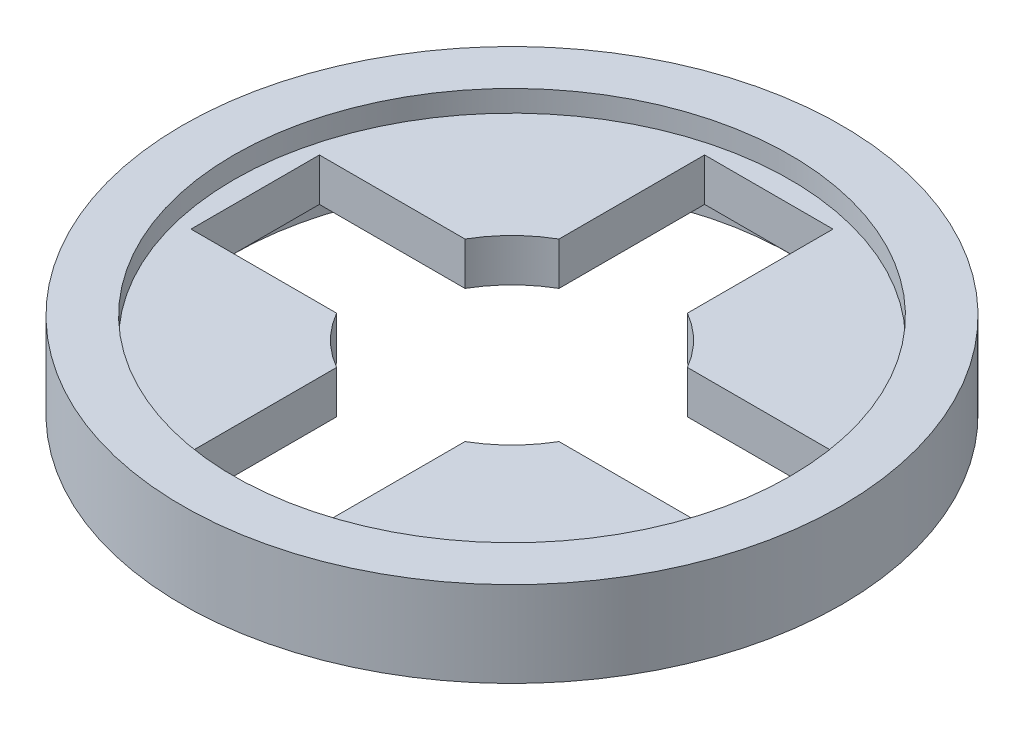
ISO-10303-21;
HEADER;
FILE_DESCRIPTION(('STEP AP214'),'2;1');
FILE_NAME('part.step','',(''),(''),'','','');
FILE_SCHEMA(('AUTOMOTIVE_DESIGN { 1 0 10303 214 1 1 1 1 }'));
ENDSEC;
DATA;
#1=APPLICATION_CONTEXT('core data for automotive mechanical design processes');
#2=APPLICATION_PROTOCOL_DEFINITION('international standard','automotive_design',2000,#1);
#3=PRODUCT_CONTEXT('',#1,'mechanical');
#4=PRODUCT('Part','Part','',(#3));
#5=PRODUCT_RELATED_PRODUCT_CATEGORY('part','',(#4));
#6=PRODUCT_DEFINITION_FORMATION('','',#4);
#7=PRODUCT_DEFINITION_CONTEXT('part definition',#1,'design');
#8=PRODUCT_DEFINITION('design','',#6,#7);
#9=PRODUCT_DEFINITION_SHAPE('','',#8);
#10=(LENGTH_UNIT() NAMED_UNIT(*) SI_UNIT(.MILLI.,.METRE.));
#11=(NAMED_UNIT(*) PLANE_ANGLE_UNIT() SI_UNIT($,.RADIAN.));
#12=(NAMED_UNIT(*) SI_UNIT($,.STERADIAN.) SOLID_ANGLE_UNIT());
#13=UNCERTAINTY_MEASURE_WITH_UNIT(LENGTH_MEASURE(1.E-05),#10,'distance_accuracy_value','');
#14=(GEOMETRIC_REPRESENTATION_CONTEXT(3) GLOBAL_UNCERTAINTY_ASSIGNED_CONTEXT((#13)) GLOBAL_UNIT_ASSIGNED_CONTEXT((#10,
#11,#12)) REPRESENTATION_CONTEXT('',''));
#15=CARTESIAN_POINT('',(0.,0.,0.));
#16=DIRECTION('',(0.,0.,1.));
#17=DIRECTION('',(1.,0.,0.));
#18=AXIS2_PLACEMENT_3D('',#15,#16,#17);
#19=CARTESIAN_POINT('',(0.,-0.5,0.));
#20=DIRECTION('',(0.,-1.,0.));
#21=DIRECTION('',(1.,0.,0.));
#22=AXIS2_PLACEMENT_3D('',#19,#20,#21);
#23=CYLINDRICAL_SURFACE('',#22,1.5);
#24=CARTESIAN_POINT('',(0.,0.249999999999999,0.));
#25=DIRECTION('',(0.,1.,0.));
#26=DIRECTION('',(-1.,0.,0.));
#27=AXIS2_PLACEMENT_3D('',#24,#25,#26);
#28=CIRCLE('',#27,1.5);
#29=CARTESIAN_POINT('',(-0.75,0.249999999999999,-1.29903810567666));
#30=VERTEX_POINT('',#29);
#31=CARTESIAN_POINT('',(-1.29903810567666,0.249999999999998,-0.75));
#32=VERTEX_POINT('',#31);
#33=EDGE_CURVE('E259',#30,#32,#28,.T.);
#34=ORIENTED_EDGE('',*,*,#33,.T.);
#35=DIRECTION('',(0.,-1.,0.));
#36=VECTOR('',#35,1.);
#37=CARTESIAN_POINT('',(-1.29903810567666,-0.500000000000001,-0.75));
#38=LINE('',#37,#36);
#39=CARTESIAN_POINT('',(-1.29903810567666,-0.250000000000001,-0.75));
#40=VERTEX_POINT('',#39);
#41=EDGE_CURVE('E170',#32,#40,#38,.T.);
#42=ORIENTED_EDGE('',*,*,#41,.T.);
#43=CARTESIAN_POINT('',(0.,-0.250000000000001,0.));
#44=DIRECTION('',(0.,-1.,0.));
#45=DIRECTION('',(1.,0.,0.));
#46=AXIS2_PLACEMENT_3D('',#43,#44,#45);
#47=CIRCLE('',#46,1.5);
#48=CARTESIAN_POINT('',(-0.75,-0.250000000000001,-1.29903810567666));
#49=VERTEX_POINT('',#48);
#50=EDGE_CURVE('E258',#40,#49,#47,.T.);
#51=ORIENTED_EDGE('',*,*,#50,.T.);
#52=DIRECTION('',(0.,-1.,0.));
#53=VECTOR('',#52,1.);
#54=CARTESIAN_POINT('',(-0.75,-0.500000000000001,-1.29903810567666));
#55=LINE('',#54,#53);
#56=EDGE_CURVE('E213',#49,#30,#55,.F.);
#57=ORIENTED_EDGE('',*,*,#56,.T.);
#58=EDGE_LOOP('',(#34,#42,#51,#57));
#59=FACE_BOUND('',#58,.T.);
#60=ADVANCED_FACE('F37',(#59),#23,.F.);
#61=CARTESIAN_POINT('',(0.,-0.250000000000001,0.));
#62=DIRECTION('',(0.,-1.,0.));
#63=DIRECTION('',(1.,0.,0.));
#64=AXIS2_PLACEMENT_3D('',#61,#62,#63);
#65=PLANE('',#64);
#66=CARTESIAN_POINT('',(0.,-0.250000000000001,0.));
#67=DIRECTION('',(0.,-1.,0.));
#68=DIRECTION('',(1.,0.,0.));
#69=AXIS2_PLACEMENT_3D('',#66,#67,#68);
#70=CIRCLE('',#69,3.25);
#71=CARTESIAN_POINT('',(3.25,-0.25,0.));
#72=VERTEX_POINT('',#71);
#73=EDGE_CURVE('E239',#72,#72,#70,.T.);
#74=ORIENTED_EDGE('',*,*,#73,.T.);
#75=EDGE_LOOP('',(#74));
#76=FACE_BOUND('',#75,.T.);
#77=ORIENTED_EDGE('',*,*,#50,.F.);
#78=DIRECTION('',(-1.,0.,0.));
#79=VECTOR('',#78,1.);
#80=CARTESIAN_POINT('',(0.,-0.250000000000001,-0.75));
#81=LINE('',#80,#79);
#82=CARTESIAN_POINT('',(-3.,-0.250000000000004,-0.75));
#83=VERTEX_POINT('',#82);
#84=EDGE_CURVE('E169',#40,#83,#81,.T.);
#85=ORIENTED_EDGE('',*,*,#84,.T.);
#86=DIRECTION('',(0.,0.,1.));
#87=VECTOR('',#86,1.);
#88=CARTESIAN_POINT('',(-3.,-0.250000000000003,0.));
#89=LINE('',#88,#87);
#90=CARTESIAN_POINT('',(-3.,-0.250000000000002,0.75));
#91=VERTEX_POINT('',#90);
#92=EDGE_CURVE('E156',#83,#91,#89,.T.);
#93=ORIENTED_EDGE('',*,*,#92,.T.);
#94=DIRECTION('',(-1.,0.,0.));
#95=VECTOR('',#94,1.);
#96=CARTESIAN_POINT('',(0.,-0.250000000000001,0.75));
#97=LINE('',#96,#95);
#98=CARTESIAN_POINT('',(-1.29903810567666,-0.250000000000001,0.75));
#99=VERTEX_POINT('',#98);
#100=EDGE_CURVE('E148',#99,#91,#97,.T.);
#101=ORIENTED_EDGE('',*,*,#100,.F.);
#102=CARTESIAN_POINT('',(-0.75,-0.250000000000001,1.29903810567666));
#103=VERTEX_POINT('',#102);
#104=EDGE_CURVE('E251',#103,#99,#47,.T.);
#105=ORIENTED_EDGE('',*,*,#104,.F.);
#106=DIRECTION('',(0.,0.,1.));
#107=VECTOR('',#106,1.);
#108=CARTESIAN_POINT('',(-0.75,-0.250000000000002,0.));
#109=LINE('',#108,#107);
#110=CARTESIAN_POINT('',(-0.750000000000001,-0.250000000000002,3.));
#111=VERTEX_POINT('',#110);
#112=EDGE_CURVE('E229',#103,#111,#109,.T.);
#113=ORIENTED_EDGE('',*,*,#112,.T.);
#114=DIRECTION('',(-1.,0.,0.));
#115=VECTOR('',#114,1.);
#116=CARTESIAN_POINT('',(0.,-0.250000000000001,3.));
#117=LINE('',#116,#115);
#118=CARTESIAN_POINT('',(0.749999999999999,-0.250000000000002,3.));
#119=VERTEX_POINT('',#118);
#120=EDGE_CURVE('E224',#119,#111,#117,.T.);
#121=ORIENTED_EDGE('',*,*,#120,.F.);
#122=DIRECTION('',(0.,0.,1.));
#123=VECTOR('',#122,1.);
#124=CARTESIAN_POINT('',(0.75,-0.250000000000001,0.));
#125=LINE('',#124,#123);
#126=CARTESIAN_POINT('',(0.75,-0.250000000000001,1.29903810567666));
#127=VERTEX_POINT('',#126);
#128=EDGE_CURVE('E222',#127,#119,#125,.T.);
#129=ORIENTED_EDGE('',*,*,#128,.F.);
#130=CARTESIAN_POINT('',(1.29903810567666,-0.250000000000001,0.75));
#131=VERTEX_POINT('',#130);
#132=EDGE_CURVE('E242',#131,#127,#47,.T.);
#133=ORIENTED_EDGE('',*,*,#132,.F.);
#134=DIRECTION('',(-1.,0.,0.));
#135=VECTOR('',#134,1.);
#136=CARTESIAN_POINT('',(0.,-0.250000000000001,0.75));
#137=LINE('',#136,#135);
#138=CARTESIAN_POINT('',(3.,-0.25,0.75));
#139=VERTEX_POINT('',#138);
#140=EDGE_CURVE('E191',#139,#131,#137,.T.);
#141=ORIENTED_EDGE('',*,*,#140,.F.);
#142=DIRECTION('',(0.,0.,1.));
#143=VECTOR('',#142,1.);
#144=CARTESIAN_POINT('',(3.,-0.25,0.));
#145=LINE('',#144,#143);
#146=CARTESIAN_POINT('',(3.,-0.25,-0.75));
#147=VERTEX_POINT('',#146);
#148=EDGE_CURVE('E187',#147,#139,#145,.T.);
#149=ORIENTED_EDGE('',*,*,#148,.F.);
#150=DIRECTION('',(-1.,0.,0.));
#151=VECTOR('',#150,1.);
#152=CARTESIAN_POINT('',(0.,-0.250000000000001,-0.75));
#153=LINE('',#152,#151);
#154=CARTESIAN_POINT('',(1.29903810567666,-0.250000000000001,-0.75));
#155=VERTEX_POINT('',#154);
#156=EDGE_CURVE('E184',#147,#155,#153,.T.);
#157=ORIENTED_EDGE('',*,*,#156,.T.);
#158=CARTESIAN_POINT('',(0.75,-0.250000000000001,-1.29903810567666));
#159=VERTEX_POINT('',#158);
#160=EDGE_CURVE('E255',#159,#155,#47,.T.);
#161=ORIENTED_EDGE('',*,*,#160,.F.);
#162=DIRECTION('',(0.,0.,1.));
#163=VECTOR('',#162,1.);
#164=CARTESIAN_POINT('',(0.75,-0.250000000000001,0.));
#165=LINE('',#164,#163);
#166=CARTESIAN_POINT('',(0.75,-0.250000000000002,-3.));
#167=VERTEX_POINT('',#166);
#168=EDGE_CURVE('E211',#167,#159,#165,.T.);
#169=ORIENTED_EDGE('',*,*,#168,.F.);
#170=DIRECTION('',(-1.,0.,0.));
#171=VECTOR('',#170,1.);
#172=CARTESIAN_POINT('',(0.,-0.250000000000001,-3.));
#173=LINE('',#172,#171);
#174=CARTESIAN_POINT('',(-0.75,-0.250000000000002,-3.));
#175=VERTEX_POINT('',#174);
#176=EDGE_CURVE('E197',#167,#175,#173,.T.);
#177=ORIENTED_EDGE('',*,*,#176,.T.);
#178=DIRECTION('',(0.,0.,1.));
#179=VECTOR('',#178,1.);
#180=CARTESIAN_POINT('',(-0.75,-0.250000000000002,0.));
#181=LINE('',#180,#179);
#182=EDGE_CURVE('E216',#175,#49,#181,.T.);
#183=ORIENTED_EDGE('',*,*,#182,.T.);
#184=EDGE_LOOP('',(#77,#85,#93,#101,#105,#113,#121,#129,#133,#141,#149,#157,#161,#169,#177,#183));
#185=FACE_BOUND('',#184,.T.);
#186=ADVANCED_FACE('F168',(#76,#185),#65,.T.);
#187=CARTESIAN_POINT('',(0.,0.249999999999999,0.));
#188=DIRECTION('',(0.,1.,0.));
#189=DIRECTION('',(-1.,0.,0.));
#190=AXIS2_PLACEMENT_3D('',#187,#188,#189);
#191=PLANE('',#190);
#192=CARTESIAN_POINT('',(0.,0.249999999999999,0.));
#193=DIRECTION('',(0.,1.,0.));
#194=DIRECTION('',(-1.,0.,0.));
#195=AXIS2_PLACEMENT_3D('',#192,#193,#194);
#196=CIRCLE('',#195,3.25);
#197=CARTESIAN_POINT('',(-3.25,0.249999999999997,0.));
#198=VERTEX_POINT('',#197);
#199=EDGE_CURVE('E233',#198,#198,#196,.T.);
#200=ORIENTED_EDGE('',*,*,#199,.T.);
#201=EDGE_LOOP('',(#200));
#202=FACE_BOUND('',#201,.T.);
#203=DIRECTION('',(0.,0.,-1.));
#204=VECTOR('',#203,1.);
#205=CARTESIAN_POINT('',(-3.,0.249999999999998,0.));
#206=LINE('',#205,#204);
#207=CARTESIAN_POINT('',(-3.,0.249999999999998,0.75));
#208=VERTEX_POINT('',#207);
#209=CARTESIAN_POINT('',(-3.,0.249999999999997,-0.75));
#210=VERTEX_POINT('',#209);
#211=EDGE_CURVE('E45',#208,#210,#206,.T.);
#212=ORIENTED_EDGE('',*,*,#211,.T.);
#213=DIRECTION('',(1.,0.,0.));
#214=VECTOR('',#213,1.);
#215=CARTESIAN_POINT('',(0.,0.249999999999999,-0.75));
#216=LINE('',#215,#214);
#217=EDGE_CURVE('E11',#210,#32,#216,.T.);
#218=ORIENTED_EDGE('',*,*,#217,.T.);
#219=ORIENTED_EDGE('',*,*,#33,.F.);
#220=DIRECTION('',(0.,0.,-1.));
#221=VECTOR('',#220,1.);
#222=CARTESIAN_POINT('',(-0.75,0.249999999999999,0.));
#223=LINE('',#222,#221);
#224=CARTESIAN_POINT('',(-0.75,0.249999999999999,-3.));
#225=VERTEX_POINT('',#224);
#226=EDGE_CURVE('E268',#30,#225,#223,.T.);
#227=ORIENTED_EDGE('',*,*,#226,.T.);
#228=DIRECTION('',(1.,0.,0.));
#229=VECTOR('',#228,1.);
#230=CARTESIAN_POINT('',(0.,0.249999999999999,-3.));
#231=LINE('',#230,#229);
#232=CARTESIAN_POINT('',(0.75,0.249999999999999,-3.));
#233=VERTEX_POINT('',#232);
#234=EDGE_CURVE('E254',#225,#233,#231,.T.);
#235=ORIENTED_EDGE('',*,*,#234,.T.);
#236=DIRECTION('',(0.,0.,-1.));
#237=VECTOR('',#236,1.);
#238=CARTESIAN_POINT('',(0.75,0.249999999999999,0.));
#239=LINE('',#238,#237);
#240=CARTESIAN_POINT('',(0.75,0.249999999999999,-1.29903810567666));
#241=VERTEX_POINT('',#240);
#242=EDGE_CURVE('E265',#241,#233,#239,.T.);
#243=ORIENTED_EDGE('',*,*,#242,.F.);
#244=CARTESIAN_POINT('',(1.29903810567666,0.249999999999999,-0.75));
#245=VERTEX_POINT('',#244);
#246=EDGE_CURVE('E262',#245,#241,#28,.T.);
#247=ORIENTED_EDGE('',*,*,#246,.F.);
#248=DIRECTION('',(1.,0.,0.));
#249=VECTOR('',#248,1.);
#250=CARTESIAN_POINT('',(0.,0.249999999999999,-0.75));
#251=LINE('',#250,#249);
#252=CARTESIAN_POINT('',(3.,0.25,-0.75));
#253=VERTEX_POINT('',#252);
#254=EDGE_CURVE('E279',#245,#253,#251,.T.);
#255=ORIENTED_EDGE('',*,*,#254,.T.);
#256=DIRECTION('',(0.,0.,-1.));
#257=VECTOR('',#256,1.);
#258=CARTESIAN_POINT('',(3.,0.25,0.));
#259=LINE('',#258,#257);
#260=CARTESIAN_POINT('',(3.,0.25,0.75));
#261=VERTEX_POINT('',#260);
#262=EDGE_CURVE('E282',#261,#253,#259,.T.);
#263=ORIENTED_EDGE('',*,*,#262,.F.);
#264=DIRECTION('',(1.,0.,0.));
#265=VECTOR('',#264,1.);
#266=CARTESIAN_POINT('',(0.,0.249999999999999,0.75));
#267=LINE('',#266,#265);
#268=CARTESIAN_POINT('',(1.29903810567666,0.249999999999999,0.75));
#269=VERTEX_POINT('',#268);
#270=EDGE_CURVE('E284',#269,#261,#267,.T.);
#271=ORIENTED_EDGE('',*,*,#270,.F.);
#272=CARTESIAN_POINT('',(0.749999999999999,0.249999999999999,1.29903810567666));
#273=VERTEX_POINT('',#272);
#274=EDGE_CURVE('E246',#273,#269,#28,.T.);
#275=ORIENTED_EDGE('',*,*,#274,.F.);
#276=DIRECTION('',(0.,0.,-1.));
#277=VECTOR('',#276,1.);
#278=CARTESIAN_POINT('',(0.75,0.249999999999999,0.));
#279=LINE('',#278,#277);
#280=CARTESIAN_POINT('',(0.749999999999999,0.249999999999999,3.));
#281=VERTEX_POINT('',#280);
#282=EDGE_CURVE('E271',#281,#273,#279,.T.);
#283=ORIENTED_EDGE('',*,*,#282,.F.);
#284=DIRECTION('',(1.,0.,0.));
#285=VECTOR('',#284,1.);
#286=CARTESIAN_POINT('',(0.,0.249999999999999,3.));
#287=LINE('',#286,#285);
#288=CARTESIAN_POINT('',(-0.750000000000001,0.249999999999999,3.));
#289=VERTEX_POINT('',#288);
#290=EDGE_CURVE('E273',#289,#281,#287,.T.);
#291=ORIENTED_EDGE('',*,*,#290,.F.);
#292=DIRECTION('',(0.,0.,-1.));
#293=VECTOR('',#292,1.);
#294=CARTESIAN_POINT('',(-0.75,0.249999999999999,0.));
#295=LINE('',#294,#293);
#296=CARTESIAN_POINT('',(-0.750000000000001,0.249999999999999,1.29903810567666));
#297=VERTEX_POINT('',#296);
#298=EDGE_CURVE('E276',#289,#297,#295,.T.);
#299=ORIENTED_EDGE('',*,*,#298,.T.);
#300=CARTESIAN_POINT('',(-1.29903810567666,0.249999999999998,0.75));
#301=VERTEX_POINT('',#300);
#302=EDGE_CURVE('E236',#301,#297,#28,.T.);
#303=ORIENTED_EDGE('',*,*,#302,.F.);
#304=DIRECTION('',(1.,0.,0.));
#305=VECTOR('',#304,1.);
#306=CARTESIAN_POINT('',(0.,0.249999999999999,0.75));
#307=LINE('',#306,#305);
#308=EDGE_CURVE('E286',#208,#301,#307,.T.);
#309=ORIENTED_EDGE('',*,*,#308,.F.);
#310=EDGE_LOOP('',(#212,#218,#219,#227,#235,#243,#247,#255,#263,#271,#275,#283,#291,#299,#303,#309));
#311=FACE_BOUND('',#310,.T.);
#312=ADVANCED_FACE('F288',(#202,#311),#191,.T.);
#313=ORIENTED_EDGE('',*,*,#160,.T.);
#314=DIRECTION('',(0.,-1.,0.));
#315=VECTOR('',#314,1.);
#316=CARTESIAN_POINT('',(1.29903810567666,-0.5,-0.75));
#317=LINE('',#316,#315);
#318=EDGE_CURVE('E180',#155,#245,#317,.F.);
#319=ORIENTED_EDGE('',*,*,#318,.T.);
#320=ORIENTED_EDGE('',*,*,#246,.T.);
#321=DIRECTION('',(0.,-1.,0.));
#322=VECTOR('',#321,1.);
#323=CARTESIAN_POINT('',(0.75,-0.5,-1.29903810567666));
#324=LINE('',#323,#322);
#325=EDGE_CURVE('E208',#159,#241,#324,.F.);
#326=ORIENTED_EDGE('',*,*,#325,.F.);
#327=EDGE_LOOP('',(#313,#319,#320,#326));
#328=FACE_BOUND('',#327,.T.);
#329=ADVANCED_FACE('F322',(#328),#23,.F.);
#330=DIRECTION('',(0.,-1.,0.));
#331=VECTOR('',#330,1.);
#332=CARTESIAN_POINT('',(-1.29903810567666,-0.500000000000001,0.75));
#333=LINE('',#332,#331);
#334=EDGE_CURVE('E151',#301,#99,#333,.T.);
#335=ORIENTED_EDGE('',*,*,#334,.F.);
#336=ORIENTED_EDGE('',*,*,#302,.T.);
#337=DIRECTION('',(0.,-1.,0.));
#338=VECTOR('',#337,1.);
#339=CARTESIAN_POINT('',(-0.75,-0.500000000000001,1.29903810567666));
#340=LINE('',#339,#338);
#341=EDGE_CURVE('E226',#297,#103,#340,.T.);
#342=ORIENTED_EDGE('',*,*,#341,.T.);
#343=ORIENTED_EDGE('',*,*,#104,.T.);
#344=EDGE_LOOP('',(#335,#336,#342,#343));
#345=FACE_BOUND('',#344,.T.);
#346=ADVANCED_FACE('F39',(#345),#23,.F.);
#347=DIRECTION('',(0.,-1.,0.));
#348=VECTOR('',#347,1.);
#349=CARTESIAN_POINT('',(1.29903810567666,-0.5,0.75));
#350=LINE('',#349,#348);
#351=EDGE_CURVE('E189',#131,#269,#350,.F.);
#352=ORIENTED_EDGE('',*,*,#351,.F.);
#353=ORIENTED_EDGE('',*,*,#132,.T.);
#354=DIRECTION('',(0.,-1.,0.));
#355=VECTOR('',#354,1.);
#356=CARTESIAN_POINT('',(0.75,-0.5,1.29903810567666));
#357=LINE('',#356,#355);
#358=EDGE_CURVE('E219',#273,#127,#357,.T.);
#359=ORIENTED_EDGE('',*,*,#358,.F.);
#360=ORIENTED_EDGE('',*,*,#274,.T.);
#361=EDGE_LOOP('',(#352,#353,#359,#360));
#362=FACE_BOUND('',#361,.T.);
#363=ADVANCED_FACE('F302',(#362),#23,.F.);
#364=CARTESIAN_POINT('',(1.5,-0.500000000000001,0.));
#365=DIRECTION('',(0.,-1.,0.));
#366=DIRECTION('',(1.,0.,0.));
#367=AXIS2_PLACEMENT_3D('',#364,#365,#366);
#368=PLANE('',#367);
#369=CARTESIAN_POINT('',(0.,-0.500000000000002,0.));
#370=DIRECTION('',(0.,-1.,0.));
#371=DIRECTION('',(1.,0.,0.));
#372=AXIS2_PLACEMENT_3D('',#369,#370,#371);
#373=CIRCLE('',#372,3.25);
#374=CARTESIAN_POINT('',(3.25,-0.5,0.));
#375=VERTEX_POINT('',#374);
#376=EDGE_CURVE('E243',#375,#375,#373,.T.);
#377=ORIENTED_EDGE('',*,*,#376,.F.);
#378=EDGE_LOOP('',(#377));
#379=FACE_BOUND('',#378,.T.);
#380=CARTESIAN_POINT('',(0.,-0.500000000000002,0.));
#381=DIRECTION('',(0.,-1.,0.));
#382=DIRECTION('',(1.,0.,0.));
#383=AXIS2_PLACEMENT_3D('',#380,#381,#382);
#384=CIRCLE('',#383,3.85);
#385=CARTESIAN_POINT('',(3.85,-0.5,0.));
#386=VERTEX_POINT('',#385);
#387=EDGE_CURVE('E247',#386,#386,#384,.T.);
#388=ORIENTED_EDGE('',*,*,#387,.T.);
#389=EDGE_LOOP('',(#388));
#390=FACE_BOUND('',#389,.T.);
#391=ADVANCED_FACE('F359',(#379,#390),#368,.T.);
#392=CARTESIAN_POINT('',(1.5,0.499999999999999,0.));
#393=DIRECTION('',(0.,1.,0.));
#394=DIRECTION('',(-1.,0.,0.));
#395=AXIS2_PLACEMENT_3D('',#392,#393,#394);
#396=PLANE('',#395);
#397=CARTESIAN_POINT('',(0.,0.499999999999999,0.));
#398=DIRECTION('',(0.,1.,0.));
#399=DIRECTION('',(-1.,0.,0.));
#400=AXIS2_PLACEMENT_3D('',#397,#398,#399);
#401=CIRCLE('',#400,3.25);
#402=CARTESIAN_POINT('',(-3.25,0.499999999999997,0.));
#403=VERTEX_POINT('',#402);
#404=EDGE_CURVE('E232',#403,#403,#401,.T.);
#405=ORIENTED_EDGE('',*,*,#404,.F.);
#406=EDGE_LOOP('',(#405));
#407=FACE_BOUND('',#406,.T.);
#408=CARTESIAN_POINT('',(0.,0.499999999999999,0.));
#409=DIRECTION('',(0.,1.,0.));
#410=DIRECTION('',(-1.,0.,0.));
#411=AXIS2_PLACEMENT_3D('',#408,#409,#410);
#412=CIRCLE('',#411,3.85);
#413=CARTESIAN_POINT('',(-3.85,0.499999999999997,0.));
#414=VERTEX_POINT('',#413);
#415=EDGE_CURVE('E250',#414,#414,#412,.T.);
#416=ORIENTED_EDGE('',*,*,#415,.T.);
#417=EDGE_LOOP('',(#416));
#418=FACE_BOUND('',#417,.T.);
#419=ADVANCED_FACE('F363',(#407,#418),#396,.T.);
#420=CARTESIAN_POINT('',(0.,9.5,0.));
#421=DIRECTION('',(0.,-1.,0.));
#422=DIRECTION('',(1.,0.,0.));
#423=AXIS2_PLACEMENT_3D('',#420,#421,#422);
#424=CYLINDRICAL_SURFACE('',#423,3.85);
#425=ORIENTED_EDGE('',*,*,#415,.F.);
#426=EDGE_LOOP('',(#425));
#427=FACE_BOUND('',#426,.T.);
#428=ORIENTED_EDGE('',*,*,#387,.F.);
#429=EDGE_LOOP('',(#428));
#430=FACE_BOUND('',#429,.T.);
#431=ADVANCED_FACE('F370',(#427,#430),#424,.T.);
#432=CARTESIAN_POINT('',(0.,-0.250000000000001,0.));
#433=DIRECTION('',(0.,-1.,0.));
#434=DIRECTION('',(1.,0.,0.));
#435=AXIS2_PLACEMENT_3D('',#432,#433,#434);
#436=CYLINDRICAL_SURFACE('',#435,3.25);
#437=ORIENTED_EDGE('',*,*,#73,.F.);
#438=EDGE_LOOP('',(#437));
#439=FACE_BOUND('',#438,.T.);
#440=ORIENTED_EDGE('',*,*,#376,.T.);
#441=EDGE_LOOP('',(#440));
#442=FACE_BOUND('',#441,.T.);
#443=ADVANCED_FACE('F341',(#439,#442),#436,.F.);
#444=CARTESIAN_POINT('',(0.,0.249999999999999,0.));
#445=DIRECTION('',(0.,1.,0.));
#446=DIRECTION('',(-1.,0.,0.));
#447=AXIS2_PLACEMENT_3D('',#444,#445,#446);
#448=CYLINDRICAL_SURFACE('',#447,3.25);
#449=ORIENTED_EDGE('',*,*,#199,.F.);
#450=EDGE_LOOP('',(#449));
#451=FACE_BOUND('',#450,.T.);
#452=ORIENTED_EDGE('',*,*,#404,.T.);
#453=EDGE_LOOP('',(#452));
#454=FACE_BOUND('',#453,.T.);
#455=ADVANCED_FACE('F334',(#451,#454),#448,.F.);
#456=CARTESIAN_POINT('',(-0.750000000000004,9.5,0.));
#457=DIRECTION('',(1.,0.,0.));
#458=DIRECTION('',(0.,1.,0.));
#459=AXIS2_PLACEMENT_3D('',#456,#457,#458);
#460=PLANE('',#459);
#461=DIRECTION('',(0.,-1.,0.));
#462=VECTOR('',#461,1.);
#463=CARTESIAN_POINT('',(-0.750000000000004,9.5,-3.));
#464=LINE('',#463,#462);
#465=EDGE_CURVE('E193',#225,#175,#464,.T.);
#466=ORIENTED_EDGE('',*,*,#465,.F.);
#467=ORIENTED_EDGE('',*,*,#226,.F.);
#468=ORIENTED_EDGE('',*,*,#56,.F.);
#469=ORIENTED_EDGE('',*,*,#182,.F.);
#470=EDGE_LOOP('',(#466,#467,#468,#469));
#471=FACE_BOUND('',#470,.T.);
#472=ADVANCED_FACE('F332',(#471),#460,.T.);
#473=CARTESIAN_POINT('',(0.749999999999996,9.5,0.));
#474=DIRECTION('',(1.,0.,0.));
#475=DIRECTION('',(0.,1.,0.));
#476=AXIS2_PLACEMENT_3D('',#473,#474,#475);
#477=PLANE('',#476);
#478=ORIENTED_EDGE('',*,*,#168,.T.);
#479=ORIENTED_EDGE('',*,*,#325,.T.);
#480=ORIENTED_EDGE('',*,*,#242,.T.);
#481=DIRECTION('',(0.,-1.,0.));
#482=VECTOR('',#481,1.);
#483=CARTESIAN_POINT('',(0.749999999999996,9.5,-3.));
#484=LINE('',#483,#482);
#485=EDGE_CURVE('E201',#233,#167,#484,.T.);
#486=ORIENTED_EDGE('',*,*,#485,.T.);
#487=EDGE_LOOP('',(#478,#479,#480,#486));
#488=FACE_BOUND('',#487,.T.);
#489=ADVANCED_FACE('F326',(#488),#477,.F.);
#490=CARTESIAN_POINT('',(0.,9.5,-3.));
#491=DIRECTION('',(0.,0.,1.));
#492=DIRECTION('',(1.,0.,0.));
#493=AXIS2_PLACEMENT_3D('',#490,#491,#492);
#494=PLANE('',#493);
#495=ORIENTED_EDGE('',*,*,#485,.F.);
#496=ORIENTED_EDGE('',*,*,#234,.F.);
#497=ORIENTED_EDGE('',*,*,#465,.T.);
#498=ORIENTED_EDGE('',*,*,#176,.F.);
#499=EDGE_LOOP('',(#495,#496,#497,#498));
#500=FACE_BOUND('',#499,.T.);
#501=ADVANCED_FACE('F330',(#500),#494,.T.);
#502=CARTESIAN_POINT('',(-0.750000000000004,9.5,0.));
#503=DIRECTION('',(1.,0.,0.));
#504=DIRECTION('',(0.,1.,0.));
#505=AXIS2_PLACEMENT_3D('',#502,#503,#504);
#506=PLANE('',#505);
#507=ORIENTED_EDGE('',*,*,#341,.F.);
#508=ORIENTED_EDGE('',*,*,#298,.F.);
#509=DIRECTION('',(0.,-1.,0.));
#510=VECTOR('',#509,1.);
#511=CARTESIAN_POINT('',(-0.750000000000005,9.5,3.));
#512=LINE('',#511,#510);
#513=EDGE_CURVE('E194',#289,#111,#512,.T.);
#514=ORIENTED_EDGE('',*,*,#513,.T.);
#515=ORIENTED_EDGE('',*,*,#112,.F.);
#516=EDGE_LOOP('',(#507,#508,#514,#515));
#517=FACE_BOUND('',#516,.T.);
#518=ADVANCED_FACE('F316',(#517),#506,.T.);
#519=CARTESIAN_POINT('',(0.,9.5,3.));
#520=DIRECTION('',(0.,0.,1.));
#521=DIRECTION('',(1.,0.,0.));
#522=AXIS2_PLACEMENT_3D('',#519,#520,#521);
#523=PLANE('',#522);
#524=ORIENTED_EDGE('',*,*,#120,.T.);
#525=ORIENTED_EDGE('',*,*,#513,.F.);
#526=ORIENTED_EDGE('',*,*,#290,.T.);
#527=DIRECTION('',(0.,-1.,0.));
#528=VECTOR('',#527,1.);
#529=CARTESIAN_POINT('',(0.749999999999995,9.5,3.));
#530=LINE('',#529,#528);
#531=EDGE_CURVE('E198',#281,#119,#530,.T.);
#532=ORIENTED_EDGE('',*,*,#531,.T.);
#533=EDGE_LOOP('',(#524,#525,#526,#532));
#534=FACE_BOUND('',#533,.T.);
#535=ADVANCED_FACE('F313',(#534),#523,.F.);
#536=CARTESIAN_POINT('',(0.749999999999996,9.5,0.));
#537=DIRECTION('',(1.,0.,0.));
#538=DIRECTION('',(0.,1.,0.));
#539=AXIS2_PLACEMENT_3D('',#536,#537,#538);
#540=PLANE('',#539);
#541=ORIENTED_EDGE('',*,*,#128,.T.);
#542=ORIENTED_EDGE('',*,*,#531,.F.);
#543=ORIENTED_EDGE('',*,*,#282,.T.);
#544=ORIENTED_EDGE('',*,*,#358,.T.);
#545=EDGE_LOOP('',(#541,#542,#543,#544));
#546=FACE_BOUND('',#545,.T.);
#547=ADVANCED_FACE('F308',(#546),#540,.F.);
#548=CARTESIAN_POINT('',(0.,9.5,0.75));
#549=DIRECTION('',(0.,0.,1.));
#550=DIRECTION('',(1.,0.,0.));
#551=AXIS2_PLACEMENT_3D('',#548,#549,#550);
#552=PLANE('',#551);
#553=ORIENTED_EDGE('',*,*,#140,.T.);
#554=ORIENTED_EDGE('',*,*,#351,.T.);
#555=ORIENTED_EDGE('',*,*,#270,.T.);
#556=DIRECTION('',(0.,-1.,0.));
#557=VECTOR('',#556,1.);
#558=CARTESIAN_POINT('',(3.,9.5,0.75));
#559=LINE('',#558,#557);
#560=EDGE_CURVE('E177',#261,#139,#559,.T.);
#561=ORIENTED_EDGE('',*,*,#560,.T.);
#562=EDGE_LOOP('',(#553,#554,#555,#561));
#563=FACE_BOUND('',#562,.T.);
#564=ADVANCED_FACE('F476',(#563),#552,.F.);
#565=CARTESIAN_POINT('',(3.,9.5,0.));
#566=DIRECTION('',(1.,0.,0.));
#567=DIRECTION('',(0.,1.,0.));
#568=AXIS2_PLACEMENT_3D('',#565,#566,#567);
#569=PLANE('',#568);
#570=ORIENTED_EDGE('',*,*,#148,.T.);
#571=ORIENTED_EDGE('',*,*,#560,.F.);
#572=ORIENTED_EDGE('',*,*,#262,.T.);
#573=DIRECTION('',(0.,-1.,0.));
#574=VECTOR('',#573,1.);
#575=CARTESIAN_POINT('',(3.,9.5,-0.75));
#576=LINE('',#575,#574);
#577=EDGE_CURVE('E60',#253,#147,#576,.T.);
#578=ORIENTED_EDGE('',*,*,#577,.T.);
#579=EDGE_LOOP('',(#570,#571,#572,#578));
#580=FACE_BOUND('',#579,.T.);
#581=ADVANCED_FACE('F484',(#580),#569,.F.);
#582=CARTESIAN_POINT('',(0.,9.5,-0.75));
#583=DIRECTION('',(0.,0.,1.));
#584=DIRECTION('',(1.,0.,0.));
#585=AXIS2_PLACEMENT_3D('',#582,#583,#584);
#586=PLANE('',#585);
#587=ORIENTED_EDGE('',*,*,#577,.F.);
#588=ORIENTED_EDGE('',*,*,#254,.F.);
#589=ORIENTED_EDGE('',*,*,#318,.F.);
#590=ORIENTED_EDGE('',*,*,#156,.F.);
#591=EDGE_LOOP('',(#587,#588,#589,#590));
#592=FACE_BOUND('',#591,.T.);
#593=ADVANCED_FACE('F493',(#592),#586,.T.);
#594=CARTESIAN_POINT('',(0.,9.5,-0.75));
#595=DIRECTION('',(0.,0.,1.));
#596=DIRECTION('',(1.,0.,0.));
#597=AXIS2_PLACEMENT_3D('',#594,#595,#596);
#598=PLANE('',#597);
#599=ORIENTED_EDGE('',*,*,#41,.F.);
#600=ORIENTED_EDGE('',*,*,#217,.F.);
#601=DIRECTION('',(0.,-1.,0.));
#602=VECTOR('',#601,1.);
#603=CARTESIAN_POINT('',(-3.,9.5,-0.75));
#604=LINE('',#603,#602);
#605=EDGE_CURVE('E164',#210,#83,#604,.T.);
#606=ORIENTED_EDGE('',*,*,#605,.T.);
#607=ORIENTED_EDGE('',*,*,#84,.F.);
#608=EDGE_LOOP('',(#599,#600,#606,#607));
#609=FACE_BOUND('',#608,.T.);
#610=ADVANCED_FACE('F295',(#609),#598,.T.);
#611=CARTESIAN_POINT('',(-3.,9.5,0.));
#612=DIRECTION('',(1.,0.,0.));
#613=DIRECTION('',(0.,1.,0.));
#614=AXIS2_PLACEMENT_3D('',#611,#612,#613);
#615=PLANE('',#614);
#616=ORIENTED_EDGE('',*,*,#605,.F.);
#617=ORIENTED_EDGE('',*,*,#211,.F.);
#618=DIRECTION('',(0.,-1.,0.));
#619=VECTOR('',#618,1.);
#620=CARTESIAN_POINT('',(-3.,9.5,0.75));
#621=LINE('',#620,#619);
#622=EDGE_CURVE('E52',#208,#91,#621,.T.);
#623=ORIENTED_EDGE('',*,*,#622,.T.);
#624=ORIENTED_EDGE('',*,*,#92,.F.);
#625=EDGE_LOOP('',(#616,#617,#623,#624));
#626=FACE_BOUND('',#625,.T.);
#627=ADVANCED_FACE('F160',(#626),#615,.T.);
#628=CARTESIAN_POINT('',(0.,9.5,0.75));
#629=DIRECTION('',(0.,0.,1.));
#630=DIRECTION('',(1.,0.,0.));
#631=AXIS2_PLACEMENT_3D('',#628,#629,#630);
#632=PLANE('',#631);
#633=ORIENTED_EDGE('',*,*,#100,.T.);
#634=ORIENTED_EDGE('',*,*,#622,.F.);
#635=ORIENTED_EDGE('',*,*,#308,.T.);
#636=ORIENTED_EDGE('',*,*,#334,.T.);
#637=EDGE_LOOP('',(#633,#634,#635,#636));
#638=FACE_BOUND('',#637,.T.);
#639=ADVANCED_FACE('F149',(#638),#632,.F.);
#640=CLOSED_SHELL('',(#60,#186,#312,#329,#346,#363,#391,#419,#431,#443,#455,#472,#489,#501,#518,
#535,#547,#564,#581,#593,#610,#627,#639));
#641=MANIFOLD_SOLID_BREP('B2',#640);
#642=ADVANCED_BREP_SHAPE_REPRESENTATION('',(#18,#641),#14);
#643=SHAPE_DEFINITION_REPRESENTATION(#9,#642);
ENDSEC;
END-ISO-10303-21;
